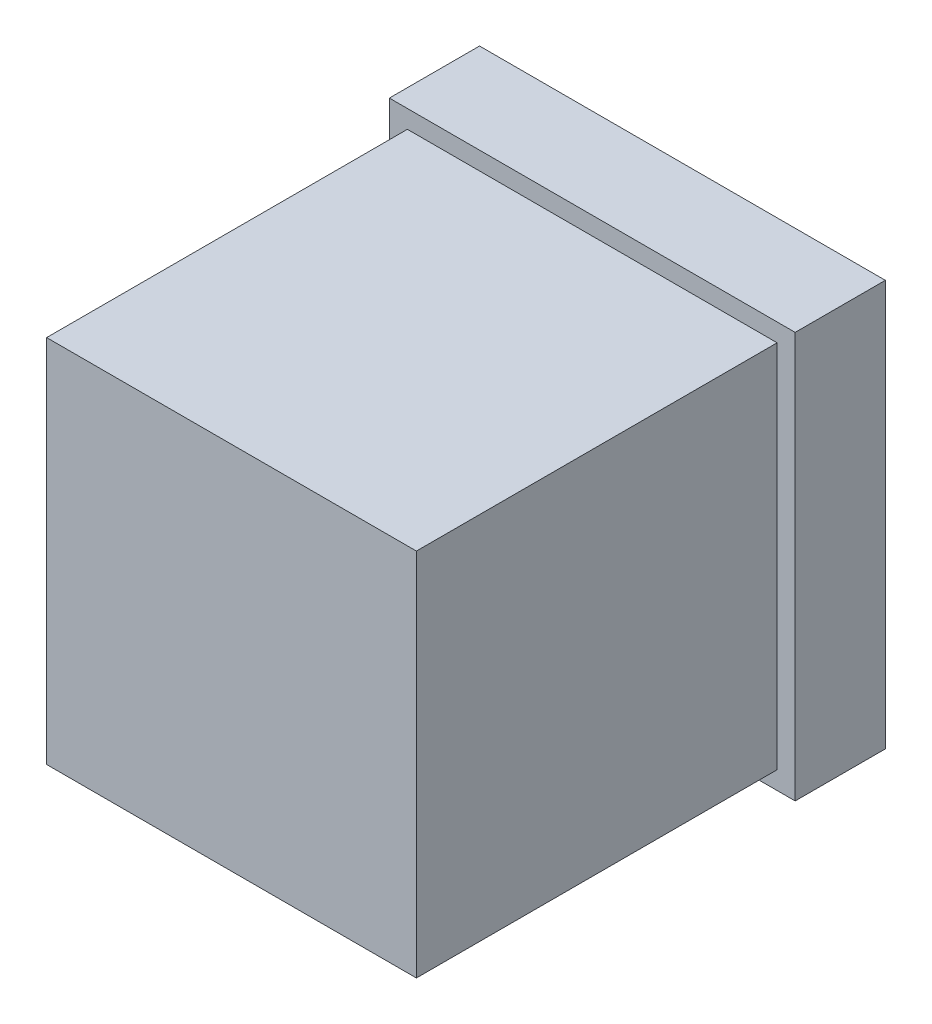
ISO-10303-21;
HEADER;
FILE_DESCRIPTION(('STEP AP214'),'2;1');
FILE_NAME('part.step','',(''),(''),'','','');
FILE_SCHEMA(('AUTOMOTIVE_DESIGN { 1 0 10303 214 1 1 1 1 }'));
ENDSEC;
DATA;
#1=APPLICATION_CONTEXT('core data for automotive mechanical design processes');
#2=APPLICATION_PROTOCOL_DEFINITION('international standard','automotive_design',2000,#1);
#3=PRODUCT_CONTEXT('',#1,'mechanical');
#4=PRODUCT('Part','Part','',(#3));
#5=PRODUCT_RELATED_PRODUCT_CATEGORY('part','',(#4));
#6=PRODUCT_DEFINITION_FORMATION('','',#4);
#7=PRODUCT_DEFINITION_CONTEXT('part definition',#1,'design');
#8=PRODUCT_DEFINITION('design','',#6,#7);
#9=PRODUCT_DEFINITION_SHAPE('','',#8);
#10=(LENGTH_UNIT() NAMED_UNIT(*) SI_UNIT(.MILLI.,.METRE.));
#11=(NAMED_UNIT(*) PLANE_ANGLE_UNIT() SI_UNIT($,.RADIAN.));
#12=(NAMED_UNIT(*) SI_UNIT($,.STERADIAN.) SOLID_ANGLE_UNIT());
#13=UNCERTAINTY_MEASURE_WITH_UNIT(LENGTH_MEASURE(1.E-05),#10,'distance_accuracy_value','');
#14=(GEOMETRIC_REPRESENTATION_CONTEXT(3) GLOBAL_UNCERTAINTY_ASSIGNED_CONTEXT((#13)) GLOBAL_UNIT_ASSIGNED_CONTEXT((#10,
#11,#12)) REPRESENTATION_CONTEXT('',''));
#15=CARTESIAN_POINT('',(0.,0.,0.));
#16=DIRECTION('',(0.,0.,1.));
#17=DIRECTION('',(1.,0.,0.));
#18=AXIS2_PLACEMENT_3D('',#15,#16,#17);
#19=CARTESIAN_POINT('',(0.,0.,10.));
#20=DIRECTION('',(0.,0.,-1.));
#21=DIRECTION('',(-1.,0.,0.));
#22=AXIS2_PLACEMENT_3D('',#19,#20,#21);
#23=PLANE('',#22);
#24=DIRECTION('',(0.,-1.,0.));
#25=VECTOR('',#24,1.);
#26=CARTESIAN_POINT('',(0.,0.,10.));
#27=LINE('',#26,#25);
#28=CARTESIAN_POINT('',(0.,45.,10.));
#29=VERTEX_POINT('',#28);
#30=CARTESIAN_POINT('',(0.,0.,10.));
#31=VERTEX_POINT('',#30);
#32=EDGE_CURVE('E145',#29,#31,#27,.T.);
#33=ORIENTED_EDGE('',*,*,#32,.T.);
#34=DIRECTION('',(1.,0.,0.));
#35=VECTOR('',#34,1.);
#36=CARTESIAN_POINT('',(0.,0.,10.));
#37=LINE('',#36,#35);
#38=CARTESIAN_POINT('',(45.,0.,10.));
#39=VERTEX_POINT('',#38);
#40=EDGE_CURVE('E149',#31,#39,#37,.T.);
#41=ORIENTED_EDGE('',*,*,#40,.T.);
#42=DIRECTION('',(0.,1.,0.));
#43=VECTOR('',#42,1.);
#44=CARTESIAN_POINT('',(45.,0.,10.));
#45=LINE('',#44,#43);
#46=CARTESIAN_POINT('',(45.,45.,10.));
#47=VERTEX_POINT('',#46);
#48=EDGE_CURVE('E153',#39,#47,#45,.T.);
#49=ORIENTED_EDGE('',*,*,#48,.T.);
#50=DIRECTION('',(-1.,0.,0.));
#51=VECTOR('',#50,1.);
#52=CARTESIAN_POINT('',(0.,45.,10.));
#53=LINE('',#52,#51);
#54=EDGE_CURVE('E156',#47,#29,#53,.T.);
#55=ORIENTED_EDGE('',*,*,#54,.T.);
#56=EDGE_LOOP('',(#33,#41,#49,#55));
#57=FACE_BOUND('',#56,.T.);
#58=DIRECTION('',(0.,-1.,0.));
#59=VECTOR('',#58,1.);
#60=CARTESIAN_POINT('',(2.,43.,10.));
#61=LINE('',#60,#59);
#62=CARTESIAN_POINT('',(2.,43.,10.));
#63=VERTEX_POINT('',#62);
#64=CARTESIAN_POINT('',(2.00000000000001,2.,10.));
#65=VERTEX_POINT('',#64);
#66=EDGE_CURVE('E61',#63,#65,#61,.T.);
#67=ORIENTED_EDGE('',*,*,#66,.F.);
#68=DIRECTION('',(-1.,0.,0.));
#69=VECTOR('',#68,1.);
#70=CARTESIAN_POINT('',(2.,43.,10.));
#71=LINE('',#70,#69);
#72=CARTESIAN_POINT('',(43.,43.,10.));
#73=VERTEX_POINT('',#72);
#74=EDGE_CURVE('E65',#73,#63,#71,.T.);
#75=ORIENTED_EDGE('',*,*,#74,.F.);
#76=DIRECTION('',(0.,1.,0.));
#77=VECTOR('',#76,1.);
#78=CARTESIAN_POINT('',(43.,43.,10.));
#79=LINE('',#78,#77);
#80=CARTESIAN_POINT('',(43.,2.,10.));
#81=VERTEX_POINT('',#80);
#82=EDGE_CURVE('E274',#81,#73,#79,.T.);
#83=ORIENTED_EDGE('',*,*,#82,.F.);
#84=DIRECTION('',(1.,0.,0.));
#85=VECTOR('',#84,1.);
#86=CARTESIAN_POINT('',(2.00000000000001,2.,10.));
#87=LINE('',#86,#85);
#88=EDGE_CURVE('E284',#65,#81,#87,.T.);
#89=ORIENTED_EDGE('',*,*,#88,.F.);
#90=EDGE_LOOP('',(#67,#75,#83,#89));
#91=FACE_BOUND('',#90,.T.);
#92=ADVANCED_FACE('F45',(#57,#91),#23,.F.);
#93=CARTESIAN_POINT('',(0.,0.,10.));
#94=DIRECTION('',(1.,0.,0.));
#95=DIRECTION('',(0.,0.,-1.));
#96=AXIS2_PLACEMENT_3D('',#93,#94,#95);
#97=PLANE('',#96);
#98=DIRECTION('',(0.,-1.,0.));
#99=VECTOR('',#98,1.);
#100=CARTESIAN_POINT('',(0.,0.,0.));
#101=LINE('',#100,#99);
#102=CARTESIAN_POINT('',(0.,45.,0.));
#103=VERTEX_POINT('',#102);
#104=CARTESIAN_POINT('',(0.,0.,0.));
#105=VERTEX_POINT('',#104);
#106=EDGE_CURVE('E134',#103,#105,#101,.T.);
#107=ORIENTED_EDGE('',*,*,#106,.T.);
#108=DIRECTION('',(0.,0.,-1.));
#109=VECTOR('',#108,1.);
#110=CARTESIAN_POINT('',(0.,0.,10.));
#111=LINE('',#110,#109);
#112=EDGE_CURVE('E11',#31,#105,#111,.T.);
#113=ORIENTED_EDGE('',*,*,#112,.F.);
#114=ORIENTED_EDGE('',*,*,#32,.F.);
#115=DIRECTION('',(0.,0.,-1.));
#116=VECTOR('',#115,1.);
#117=CARTESIAN_POINT('',(0.,45.,10.));
#118=LINE('',#117,#116);
#119=EDGE_CURVE('E158',#29,#103,#118,.T.);
#120=ORIENTED_EDGE('',*,*,#119,.T.);
#121=EDGE_LOOP('',(#107,#113,#114,#120));
#122=FACE_BOUND('',#121,.T.);
#123=ADVANCED_FACE('F47',(#122),#97,.F.);
#124=CARTESIAN_POINT('',(0.,0.,10.));
#125=DIRECTION('',(0.,1.,0.));
#126=DIRECTION('',(0.,0.,1.));
#127=AXIS2_PLACEMENT_3D('',#124,#125,#126);
#128=PLANE('',#127);
#129=DIRECTION('',(1.,0.,0.));
#130=VECTOR('',#129,1.);
#131=CARTESIAN_POINT('',(0.,0.,0.));
#132=LINE('',#131,#130);
#133=CARTESIAN_POINT('',(45.,0.,0.));
#134=VERTEX_POINT('',#133);
#135=EDGE_CURVE('E139',#105,#134,#132,.T.);
#136=ORIENTED_EDGE('',*,*,#135,.T.);
#137=DIRECTION('',(0.,0.,-1.));
#138=VECTOR('',#137,1.);
#139=CARTESIAN_POINT('',(45.,0.,10.));
#140=LINE('',#139,#138);
#141=EDGE_CURVE('E54',#39,#134,#140,.T.);
#142=ORIENTED_EDGE('',*,*,#141,.F.);
#143=ORIENTED_EDGE('',*,*,#40,.F.);
#144=ORIENTED_EDGE('',*,*,#112,.T.);
#145=EDGE_LOOP('',(#136,#142,#143,#144));
#146=FACE_BOUND('',#145,.T.);
#147=ADVANCED_FACE('F194',(#146),#128,.F.);
#148=CARTESIAN_POINT('',(45.,0.,10.));
#149=DIRECTION('',(-1.,0.,0.));
#150=DIRECTION('',(0.,0.,1.));
#151=AXIS2_PLACEMENT_3D('',#148,#149,#150);
#152=PLANE('',#151);
#153=DIRECTION('',(0.,1.,0.));
#154=VECTOR('',#153,1.);
#155=CARTESIAN_POINT('',(45.,0.,0.));
#156=LINE('',#155,#154);
#157=CARTESIAN_POINT('',(45.,45.,0.));
#158=VERTEX_POINT('',#157);
#159=EDGE_CURVE('E162',#134,#158,#156,.T.);
#160=ORIENTED_EDGE('',*,*,#159,.T.);
#161=DIRECTION('',(0.,0.,-1.));
#162=VECTOR('',#161,1.);
#163=CARTESIAN_POINT('',(45.,45.,10.));
#164=LINE('',#163,#162);
#165=EDGE_CURVE('E170',#47,#158,#164,.T.);
#166=ORIENTED_EDGE('',*,*,#165,.F.);
#167=ORIENTED_EDGE('',*,*,#48,.F.);
#168=ORIENTED_EDGE('',*,*,#141,.T.);
#169=EDGE_LOOP('',(#160,#166,#167,#168));
#170=FACE_BOUND('',#169,.T.);
#171=ADVANCED_FACE('F179',(#170),#152,.F.);
#172=CARTESIAN_POINT('',(0.,45.,10.));
#173=DIRECTION('',(0.,-1.,0.));
#174=DIRECTION('',(0.,0.,-1.));
#175=AXIS2_PLACEMENT_3D('',#172,#173,#174);
#176=PLANE('',#175);
#177=DIRECTION('',(-1.,0.,0.));
#178=VECTOR('',#177,1.);
#179=CARTESIAN_POINT('',(0.,45.,0.));
#180=LINE('',#179,#178);
#181=EDGE_CURVE('E150',#158,#103,#180,.T.);
#182=ORIENTED_EDGE('',*,*,#181,.T.);
#183=ORIENTED_EDGE('',*,*,#119,.F.);
#184=ORIENTED_EDGE('',*,*,#54,.F.);
#185=ORIENTED_EDGE('',*,*,#165,.T.);
#186=EDGE_LOOP('',(#182,#183,#184,#185));
#187=FACE_BOUND('',#186,.T.);
#188=ADVANCED_FACE('F188',(#187),#176,.F.);
#189=CARTESIAN_POINT('',(0.,0.,0.));
#190=DIRECTION('',(0.,0.,-1.));
#191=DIRECTION('',(-1.,0.,0.));
#192=AXIS2_PLACEMENT_3D('',#189,#190,#191);
#193=PLANE('',#192);
#194=ORIENTED_EDGE('',*,*,#106,.F.);
#195=ORIENTED_EDGE('',*,*,#181,.F.);
#196=ORIENTED_EDGE('',*,*,#159,.F.);
#197=ORIENTED_EDGE('',*,*,#135,.F.);
#198=EDGE_LOOP('',(#194,#195,#196,#197));
#199=FACE_BOUND('',#198,.T.);
#200=ADVANCED_FACE('F185',(#199),#193,.T.);
#201=CARTESIAN_POINT('',(2.,43.,50.));
#202=DIRECTION('',(1.,0.,0.));
#203=DIRECTION('',(0.,1.,0.));
#204=AXIS2_PLACEMENT_3D('',#201,#202,#203);
#205=PLANE('',#204);
#206=ORIENTED_EDGE('',*,*,#66,.T.);
#207=DIRECTION('',(0.,0.,-1.));
#208=VECTOR('',#207,1.);
#209=CARTESIAN_POINT('',(2.00000000000001,2.,50.));
#210=LINE('',#209,#208);
#211=CARTESIAN_POINT('',(2.00000000000001,2.,50.));
#212=VERTEX_POINT('',#211);
#213=EDGE_CURVE('E114',#212,#65,#210,.T.);
#214=ORIENTED_EDGE('',*,*,#213,.F.);
#215=DIRECTION('',(0.,-1.,0.));
#216=VECTOR('',#215,1.);
#217=CARTESIAN_POINT('',(2.,43.,50.));
#218=LINE('',#217,#216);
#219=CARTESIAN_POINT('',(2.,43.,50.));
#220=VERTEX_POINT('',#219);
#221=EDGE_CURVE('E121',#220,#212,#218,.T.);
#222=ORIENTED_EDGE('',*,*,#221,.F.);
#223=DIRECTION('',(0.,0.,-1.));
#224=VECTOR('',#223,1.);
#225=CARTESIAN_POINT('',(2.,43.,50.));
#226=LINE('',#225,#224);
#227=EDGE_CURVE('E271',#220,#63,#226,.T.);
#228=ORIENTED_EDGE('',*,*,#227,.T.);
#229=EDGE_LOOP('',(#206,#214,#222,#228));
#230=FACE_BOUND('',#229,.T.);
#231=ADVANCED_FACE('F132',(#230),#205,.F.);
#232=CARTESIAN_POINT('',(2.00000000000001,2.,50.));
#233=DIRECTION('',(0.,1.,0.));
#234=DIRECTION('',(0.,0.,1.));
#235=AXIS2_PLACEMENT_3D('',#232,#233,#234);
#236=PLANE('',#235);
#237=ORIENTED_EDGE('',*,*,#88,.T.);
#238=DIRECTION('',(0.,0.,-1.));
#239=VECTOR('',#238,1.);
#240=CARTESIAN_POINT('',(43.,2.,50.));
#241=LINE('',#240,#239);
#242=CARTESIAN_POINT('',(43.,2.,50.));
#243=VERTEX_POINT('',#242);
#244=EDGE_CURVE('E116',#243,#81,#241,.T.);
#245=ORIENTED_EDGE('',*,*,#244,.F.);
#246=DIRECTION('',(1.,0.,0.));
#247=VECTOR('',#246,1.);
#248=CARTESIAN_POINT('',(2.00000000000001,2.,50.));
#249=LINE('',#248,#247);
#250=EDGE_CURVE('E109',#212,#243,#249,.T.);
#251=ORIENTED_EDGE('',*,*,#250,.F.);
#252=ORIENTED_EDGE('',*,*,#213,.T.);
#253=EDGE_LOOP('',(#237,#245,#251,#252));
#254=FACE_BOUND('',#253,.T.);
#255=ADVANCED_FACE('F112',(#254),#236,.F.);
#256=CARTESIAN_POINT('',(43.,43.,50.));
#257=DIRECTION('',(-1.,0.,0.));
#258=DIRECTION('',(0.,-1.,0.));
#259=AXIS2_PLACEMENT_3D('',#256,#257,#258);
#260=PLANE('',#259);
#261=ORIENTED_EDGE('',*,*,#82,.T.);
#262=DIRECTION('',(0.,0.,-1.));
#263=VECTOR('',#262,1.);
#264=CARTESIAN_POINT('',(43.,43.,50.));
#265=LINE('',#264,#263);
#266=CARTESIAN_POINT('',(43.,43.,50.));
#267=VERTEX_POINT('',#266);
#268=EDGE_CURVE('E141',#267,#73,#265,.T.);
#269=ORIENTED_EDGE('',*,*,#268,.F.);
#270=DIRECTION('',(0.,1.,0.));
#271=VECTOR('',#270,1.);
#272=CARTESIAN_POINT('',(43.,43.,50.));
#273=LINE('',#272,#271);
#274=EDGE_CURVE('E120',#243,#267,#273,.T.);
#275=ORIENTED_EDGE('',*,*,#274,.F.);
#276=ORIENTED_EDGE('',*,*,#244,.T.);
#277=EDGE_LOOP('',(#261,#269,#275,#276));
#278=FACE_BOUND('',#277,.T.);
#279=ADVANCED_FACE('F241',(#278),#260,.F.);
#280=CARTESIAN_POINT('',(2.,43.,50.));
#281=DIRECTION('',(0.,-1.,0.));
#282=DIRECTION('',(0.,0.,-1.));
#283=AXIS2_PLACEMENT_3D('',#280,#281,#282);
#284=PLANE('',#283);
#285=ORIENTED_EDGE('',*,*,#74,.T.);
#286=ORIENTED_EDGE('',*,*,#227,.F.);
#287=DIRECTION('',(-1.,0.,0.));
#288=VECTOR('',#287,1.);
#289=CARTESIAN_POINT('',(2.,43.,50.));
#290=LINE('',#289,#288);
#291=EDGE_CURVE('E126',#267,#220,#290,.T.);
#292=ORIENTED_EDGE('',*,*,#291,.F.);
#293=ORIENTED_EDGE('',*,*,#268,.T.);
#294=EDGE_LOOP('',(#285,#286,#292,#293));
#295=FACE_BOUND('',#294,.T.);
#296=ADVANCED_FACE('F249',(#295),#284,.F.);
#297=CARTESIAN_POINT('',(0.,0.,50.));
#298=DIRECTION('',(0.,0.,1.));
#299=DIRECTION('',(1.,0.,0.));
#300=AXIS2_PLACEMENT_3D('',#297,#298,#299);
#301=PLANE('',#300);
#302=ORIENTED_EDGE('',*,*,#221,.T.);
#303=ORIENTED_EDGE('',*,*,#250,.T.);
#304=ORIENTED_EDGE('',*,*,#274,.T.);
#305=ORIENTED_EDGE('',*,*,#291,.T.);
#306=EDGE_LOOP('',(#302,#303,#304,#305));
#307=FACE_BOUND('',#306,.T.);
#308=ADVANCED_FACE('F124',(#307),#301,.T.);
#309=CLOSED_SHELL('',(#92,#123,#147,#171,#188,#200,#231,#255,#279,#296,#308));
#310=MANIFOLD_SOLID_BREP('B2',#309);
#311=ADVANCED_BREP_SHAPE_REPRESENTATION('',(#18,#310),#14);
#312=SHAPE_DEFINITION_REPRESENTATION(#9,#311);
ENDSEC;
END-ISO-10303-21;
